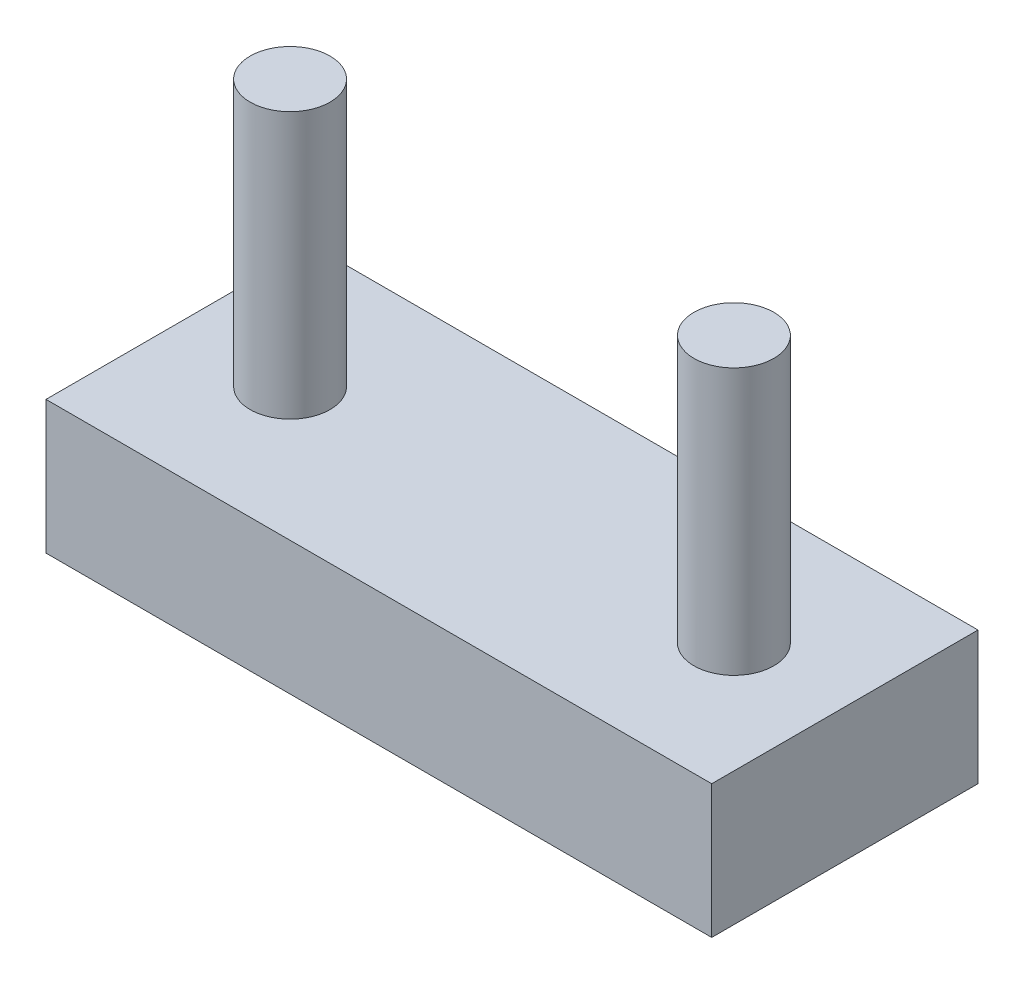
ISO-10303-21;
HEADER;
FILE_DESCRIPTION(('STEP AP214'),'2;1');
FILE_NAME('part.step','',(''),(''),'','','');
FILE_SCHEMA(('AUTOMOTIVE_DESIGN { 1 0 10303 214 1 1 1 1 }'));
ENDSEC;
DATA;
#1=APPLICATION_CONTEXT('core data for automotive mechanical design processes');
#2=APPLICATION_PROTOCOL_DEFINITION('international standard','automotive_design',2000,#1);
#3=PRODUCT_CONTEXT('',#1,'mechanical');
#4=PRODUCT('Part','Part','',(#3));
#5=PRODUCT_RELATED_PRODUCT_CATEGORY('part','',(#4));
#6=PRODUCT_DEFINITION_FORMATION('','',#4);
#7=PRODUCT_DEFINITION_CONTEXT('part definition',#1,'design');
#8=PRODUCT_DEFINITION('design','',#6,#7);
#9=PRODUCT_DEFINITION_SHAPE('','',#8);
#10=(LENGTH_UNIT() NAMED_UNIT(*) SI_UNIT(.MILLI.,.METRE.));
#11=(NAMED_UNIT(*) PLANE_ANGLE_UNIT() SI_UNIT($,.RADIAN.));
#12=(NAMED_UNIT(*) SI_UNIT($,.STERADIAN.) SOLID_ANGLE_UNIT());
#13=UNCERTAINTY_MEASURE_WITH_UNIT(LENGTH_MEASURE(1.E-05),#10,'distance_accuracy_value','');
#14=(GEOMETRIC_REPRESENTATION_CONTEXT(3) GLOBAL_UNCERTAINTY_ASSIGNED_CONTEXT((#13)) GLOBAL_UNIT_ASSIGNED_CONTEXT((#10,
#11,#12)) REPRESENTATION_CONTEXT('',''));
#15=CARTESIAN_POINT('',(0.,0.,0.));
#16=DIRECTION('',(0.,0.,1.));
#17=DIRECTION('',(1.,0.,0.));
#18=AXIS2_PLACEMENT_3D('',#15,#16,#17);
#19=CARTESIAN_POINT('',(0.,5.,0.));
#20=DIRECTION('',(1.,0.,0.));
#21=DIRECTION('',(0.,0.,-1.));
#22=AXIS2_PLACEMENT_3D('',#19,#20,#21);
#23=PLANE('',#22);
#24=DIRECTION('',(0.,0.,1.));
#25=VECTOR('',#24,1.);
#26=CARTESIAN_POINT('',(0.,0.,0.));
#27=LINE('',#26,#25);
#28=CARTESIAN_POINT('',(0.,0.,-10.));
#29=VERTEX_POINT('',#28);
#30=CARTESIAN_POINT('',(0.,0.,0.));
#31=VERTEX_POINT('',#30);
#32=EDGE_CURVE('E115',#29,#31,#27,.T.);
#33=ORIENTED_EDGE('',*,*,#32,.T.);
#34=DIRECTION('',(0.,-1.,0.));
#35=VECTOR('',#34,1.);
#36=CARTESIAN_POINT('',(0.,5.,0.));
#37=LINE('',#36,#35);
#38=CARTESIAN_POINT('',(0.,5.,0.));
#39=VERTEX_POINT('',#38);
#40=EDGE_CURVE('E104',#39,#31,#37,.T.);
#41=ORIENTED_EDGE('',*,*,#40,.F.);
#42=DIRECTION('',(0.,0.,1.));
#43=VECTOR('',#42,1.);
#44=CARTESIAN_POINT('',(0.,5.,0.));
#45=LINE('',#44,#43);
#46=CARTESIAN_POINT('',(0.,5.,-10.));
#47=VERTEX_POINT('',#46);
#48=EDGE_CURVE('E96',#47,#39,#45,.T.);
#49=ORIENTED_EDGE('',*,*,#48,.F.);
#50=DIRECTION('',(0.,-1.,0.));
#51=VECTOR('',#50,1.);
#52=CARTESIAN_POINT('',(0.,5.,-10.));
#53=LINE('',#52,#51);
#54=EDGE_CURVE('E111',#47,#29,#53,.T.);
#55=ORIENTED_EDGE('',*,*,#54,.T.);
#56=EDGE_LOOP('',(#33,#41,#49,#55));
#57=FACE_BOUND('',#56,.T.);
#58=ADVANCED_FACE('F43',(#57),#23,.F.);
#59=CARTESIAN_POINT('',(0.,5.,0.));
#60=DIRECTION('',(0.,0.,-1.));
#61=DIRECTION('',(-1.,0.,0.));
#62=AXIS2_PLACEMENT_3D('',#59,#60,#61);
#63=PLANE('',#62);
#64=DIRECTION('',(1.,0.,0.));
#65=VECTOR('',#64,1.);
#66=CARTESIAN_POINT('',(0.,0.,0.));
#67=LINE('',#66,#65);
#68=CARTESIAN_POINT('',(25.,0.,0.));
#69=VERTEX_POINT('',#68);
#70=EDGE_CURVE('E102',#31,#69,#67,.T.);
#71=ORIENTED_EDGE('',*,*,#70,.T.);
#72=DIRECTION('',(0.,-1.,0.));
#73=VECTOR('',#72,1.);
#74=CARTESIAN_POINT('',(25.,5.,0.));
#75=LINE('',#74,#73);
#76=CARTESIAN_POINT('',(25.,5.,0.));
#77=VERTEX_POINT('',#76);
#78=EDGE_CURVE('E100',#77,#69,#75,.T.);
#79=ORIENTED_EDGE('',*,*,#78,.F.);
#80=DIRECTION('',(1.,0.,0.));
#81=VECTOR('',#80,1.);
#82=CARTESIAN_POINT('',(0.,5.,0.));
#83=LINE('',#82,#81);
#84=EDGE_CURVE('E91',#39,#77,#83,.T.);
#85=ORIENTED_EDGE('',*,*,#84,.F.);
#86=ORIENTED_EDGE('',*,*,#40,.T.);
#87=EDGE_LOOP('',(#71,#79,#85,#86));
#88=FACE_BOUND('',#87,.T.);
#89=ADVANCED_FACE('F101',(#88),#63,.F.);
#90=CARTESIAN_POINT('',(25.,5.,0.));
#91=DIRECTION('',(-1.,0.,0.));
#92=DIRECTION('',(0.,0.,1.));
#93=AXIS2_PLACEMENT_3D('',#90,#91,#92);
#94=PLANE('',#93);
#95=DIRECTION('',(0.,0.,-1.));
#96=VECTOR('',#95,1.);
#97=CARTESIAN_POINT('',(25.,0.,0.));
#98=LINE('',#97,#96);
#99=CARTESIAN_POINT('',(25.,0.,-10.));
#100=VERTEX_POINT('',#99);
#101=EDGE_CURVE('E77',#69,#100,#98,.T.);
#102=ORIENTED_EDGE('',*,*,#101,.T.);
#103=DIRECTION('',(0.,-1.,0.));
#104=VECTOR('',#103,1.);
#105=CARTESIAN_POINT('',(25.,5.,-10.));
#106=LINE('',#105,#104);
#107=CARTESIAN_POINT('',(25.,5.,-10.));
#108=VERTEX_POINT('',#107);
#109=EDGE_CURVE('E105',#108,#100,#106,.T.);
#110=ORIENTED_EDGE('',*,*,#109,.F.);
#111=DIRECTION('',(0.,0.,-1.));
#112=VECTOR('',#111,1.);
#113=CARTESIAN_POINT('',(25.,5.,0.));
#114=LINE('',#113,#112);
#115=EDGE_CURVE('E94',#77,#108,#114,.T.);
#116=ORIENTED_EDGE('',*,*,#115,.F.);
#117=ORIENTED_EDGE('',*,*,#78,.T.);
#118=EDGE_LOOP('',(#102,#110,#116,#117));
#119=FACE_BOUND('',#118,.T.);
#120=ADVANCED_FACE('F107',(#119),#94,.F.);
#121=CARTESIAN_POINT('',(0.,5.,-10.));
#122=DIRECTION('',(0.,0.,1.));
#123=DIRECTION('',(1.,0.,0.));
#124=AXIS2_PLACEMENT_3D('',#121,#122,#123);
#125=PLANE('',#124);
#126=DIRECTION('',(-1.,0.,0.));
#127=VECTOR('',#126,1.);
#128=CARTESIAN_POINT('',(0.,0.,-10.));
#129=LINE('',#128,#127);
#130=EDGE_CURVE('E83',#100,#29,#129,.T.);
#131=ORIENTED_EDGE('',*,*,#130,.T.);
#132=ORIENTED_EDGE('',*,*,#54,.F.);
#133=DIRECTION('',(-1.,0.,0.));
#134=VECTOR('',#133,1.);
#135=CARTESIAN_POINT('',(0.,5.,-10.));
#136=LINE('',#135,#134);
#137=EDGE_CURVE('E60',#108,#47,#136,.T.);
#138=ORIENTED_EDGE('',*,*,#137,.F.);
#139=ORIENTED_EDGE('',*,*,#109,.T.);
#140=EDGE_LOOP('',(#131,#132,#138,#139));
#141=FACE_BOUND('',#140,.T.);
#142=ADVANCED_FACE('F139',(#141),#125,.F.);
#143=CARTESIAN_POINT('',(0.,5.,0.));
#144=DIRECTION('',(0.,-1.,0.));
#145=DIRECTION('',(0.,0.,-1.));
#146=AXIS2_PLACEMENT_3D('',#143,#144,#145);
#147=PLANE('',#146);
#148=CARTESIAN_POINT('',(20.8335,5.,-5.));
#149=DIRECTION('',(0.,-1.,0.));
#150=DIRECTION('',(0.,0.,-1.));
#151=AXIS2_PLACEMENT_3D('',#148,#149,#150);
#152=CIRCLE('',#151,1.5);
#153=CARTESIAN_POINT('',(20.8335,5.,-6.5));
#154=VERTEX_POINT('',#153);
#155=EDGE_CURVE('E11',#154,#154,#152,.F.);
#156=ORIENTED_EDGE('',*,*,#155,.F.);
#157=EDGE_LOOP('',(#156));
#158=FACE_BOUND('',#157,.T.);
#159=CARTESIAN_POINT('',(4.1665,5.,-5.));
#160=DIRECTION('',(0.,-1.,0.));
#161=DIRECTION('',(0.,0.,-1.));
#162=AXIS2_PLACEMENT_3D('',#159,#160,#161);
#163=CIRCLE('',#162,1.5);
#164=CARTESIAN_POINT('',(4.1665,5.,-6.5));
#165=VERTEX_POINT('',#164);
#166=EDGE_CURVE('E52',#165,#165,#163,.F.);
#167=ORIENTED_EDGE('',*,*,#166,.F.);
#168=EDGE_LOOP('',(#167));
#169=FACE_BOUND('',#168,.T.);
#170=ORIENTED_EDGE('',*,*,#48,.T.);
#171=ORIENTED_EDGE('',*,*,#84,.T.);
#172=ORIENTED_EDGE('',*,*,#115,.T.);
#173=ORIENTED_EDGE('',*,*,#137,.T.);
#174=EDGE_LOOP('',(#170,#171,#172,#173));
#175=FACE_BOUND('',#174,.T.);
#176=ADVANCED_FACE('F92',(#158,#169,#175),#147,.F.);
#177=CARTESIAN_POINT('',(0.,0.,0.));
#178=DIRECTION('',(0.,-1.,0.));
#179=DIRECTION('',(0.,0.,-1.));
#180=AXIS2_PLACEMENT_3D('',#177,#178,#179);
#181=PLANE('',#180);
#182=ORIENTED_EDGE('',*,*,#32,.F.);
#183=ORIENTED_EDGE('',*,*,#130,.F.);
#184=ORIENTED_EDGE('',*,*,#101,.F.);
#185=ORIENTED_EDGE('',*,*,#70,.F.);
#186=EDGE_LOOP('',(#182,#183,#184,#185));
#187=FACE_BOUND('',#186,.T.);
#188=ADVANCED_FACE('F138',(#187),#181,.T.);
#189=CARTESIAN_POINT('',(4.1665,15.,-5.));
#190=DIRECTION('',(0.,-1.,0.));
#191=DIRECTION('',(0.,0.,-1.));
#192=AXIS2_PLACEMENT_3D('',#189,#190,#191);
#193=CYLINDRICAL_SURFACE('',#192,1.5);
#194=CARTESIAN_POINT('',(4.1665,15.,-5.));
#195=DIRECTION('',(0.,1.,0.));
#196=DIRECTION('',(0.,0.,1.));
#197=AXIS2_PLACEMENT_3D('',#194,#195,#196);
#198=CIRCLE('',#197,1.5);
#199=CARTESIAN_POINT('',(4.1665,15.,-3.5));
#200=VERTEX_POINT('',#199);
#201=EDGE_CURVE('E119',#200,#200,#198,.T.);
#202=ORIENTED_EDGE('',*,*,#201,.F.);
#203=EDGE_LOOP('',(#202));
#204=FACE_BOUND('',#203,.T.);
#205=ORIENTED_EDGE('',*,*,#166,.T.);
#206=EDGE_LOOP('',(#205));
#207=FACE_BOUND('',#206,.T.);
#208=ADVANCED_FACE('F135',(#204,#207),#193,.T.);
#209=CARTESIAN_POINT('',(4.1665,15.,-5.));
#210=DIRECTION('',(0.,1.,0.));
#211=DIRECTION('',(0.,0.,1.));
#212=AXIS2_PLACEMENT_3D('',#209,#210,#211);
#213=PLANE('',#212);
#214=ORIENTED_EDGE('',*,*,#201,.T.);
#215=EDGE_LOOP('',(#214));
#216=FACE_BOUND('',#215,.T.);
#217=ADVANCED_FACE('F172',(#216),#213,.T.);
#218=CARTESIAN_POINT('',(20.8335,15.,-5.));
#219=DIRECTION('',(0.,-1.,0.));
#220=DIRECTION('',(0.,0.,-1.));
#221=AXIS2_PLACEMENT_3D('',#218,#219,#220);
#222=CYLINDRICAL_SURFACE('',#221,1.5);
#223=CARTESIAN_POINT('',(20.8335,15.,-5.));
#224=DIRECTION('',(0.,1.,0.));
#225=DIRECTION('',(0.,0.,1.));
#226=AXIS2_PLACEMENT_3D('',#223,#224,#225);
#227=CIRCLE('',#226,1.5);
#228=CARTESIAN_POINT('',(20.8335,15.,-3.5));
#229=VERTEX_POINT('',#228);
#230=EDGE_CURVE('E162',#229,#229,#227,.T.);
#231=ORIENTED_EDGE('',*,*,#230,.F.);
#232=EDGE_LOOP('',(#231));
#233=FACE_BOUND('',#232,.T.);
#234=ORIENTED_EDGE('',*,*,#155,.T.);
#235=EDGE_LOOP('',(#234));
#236=FACE_BOUND('',#235,.T.);
#237=ADVANCED_FACE('F169',(#233,#236),#222,.T.);
#238=CARTESIAN_POINT('',(20.8335,15.,-5.));
#239=DIRECTION('',(0.,1.,0.));
#240=DIRECTION('',(0.,0.,1.));
#241=AXIS2_PLACEMENT_3D('',#238,#239,#240);
#242=PLANE('',#241);
#243=ORIENTED_EDGE('',*,*,#230,.T.);
#244=EDGE_LOOP('',(#243));
#245=FACE_BOUND('',#244,.T.);
#246=ADVANCED_FACE('F167',(#245),#242,.T.);
#247=CLOSED_SHELL('',(#58,#89,#120,#142,#176,#188,#208,#217,#237,#246));
#248=MANIFOLD_SOLID_BREP('B2',#247);
#249=ADVANCED_BREP_SHAPE_REPRESENTATION('',(#18,#248),#14);
#250=SHAPE_DEFINITION_REPRESENTATION(#9,#249);
ENDSEC;
END-ISO-10303-21;
